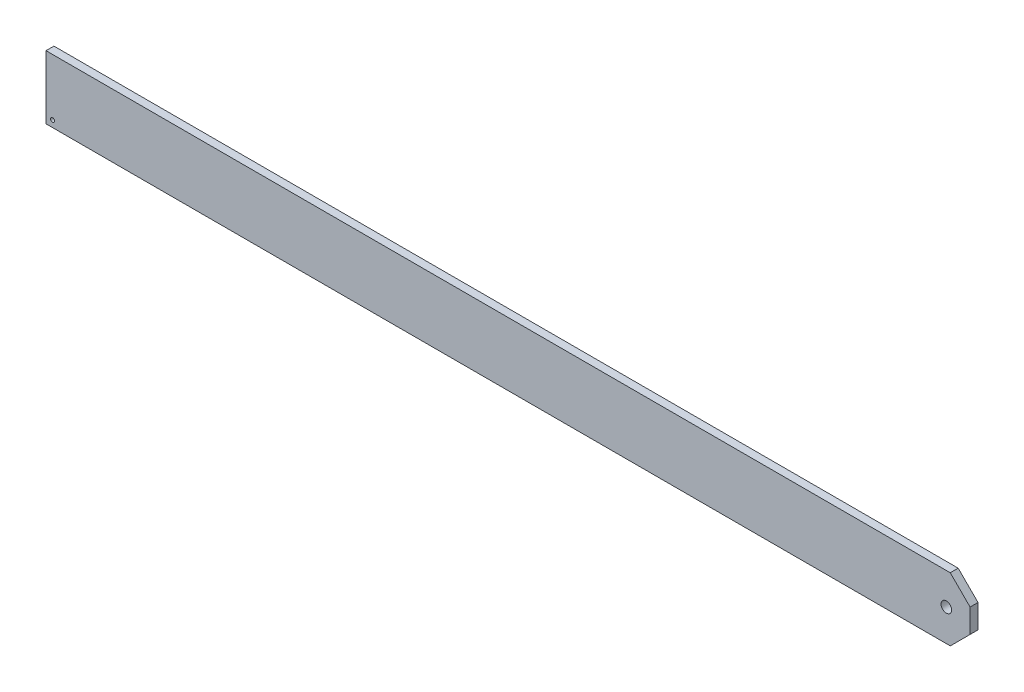
ISO-10303-21;
HEADER;
FILE_DESCRIPTION(('STEP AP214'),'2;1');
FILE_NAME('part.step','',(''),(''),'','','');
FILE_SCHEMA(('AUTOMOTIVE_DESIGN { 1 0 10303 214 1 1 1 1 }'));
ENDSEC;
DATA;
#1=APPLICATION_CONTEXT('core data for automotive mechanical design processes');
#2=APPLICATION_PROTOCOL_DEFINITION('international standard','automotive_design',2000,#1);
#3=PRODUCT_CONTEXT('',#1,'mechanical');
#4=PRODUCT('Part','Part','',(#3));
#5=PRODUCT_RELATED_PRODUCT_CATEGORY('part','',(#4));
#6=PRODUCT_DEFINITION_FORMATION('','',#4);
#7=PRODUCT_DEFINITION_CONTEXT('part definition',#1,'design');
#8=PRODUCT_DEFINITION('design','',#6,#7);
#9=PRODUCT_DEFINITION_SHAPE('','',#8);
#10=(LENGTH_UNIT() NAMED_UNIT(*) SI_UNIT(.MILLI.,.METRE.));
#11=(NAMED_UNIT(*) PLANE_ANGLE_UNIT() SI_UNIT($,.RADIAN.));
#12=(NAMED_UNIT(*) SI_UNIT($,.STERADIAN.) SOLID_ANGLE_UNIT());
#13=UNCERTAINTY_MEASURE_WITH_UNIT(LENGTH_MEASURE(1.E-05),#10,'distance_accuracy_value','');
#14=(GEOMETRIC_REPRESENTATION_CONTEXT(3) GLOBAL_UNCERTAINTY_ASSIGNED_CONTEXT((#13)) GLOBAL_UNIT_ASSIGNED_CONTEXT((#10,
#11,#12)) REPRESENTATION_CONTEXT('',''));
#15=CARTESIAN_POINT('',(0.,0.,0.));
#16=DIRECTION('',(0.,0.,1.));
#17=DIRECTION('',(1.,0.,0.));
#18=AXIS2_PLACEMENT_3D('',#15,#16,#17);
#19=CARTESIAN_POINT('',(0.,0.,6.));
#20=DIRECTION('',(0.,0.,1.));
#21=DIRECTION('',(1.,0.,0.));
#22=AXIS2_PLACEMENT_3D('',#19,#20,#21);
#23=PLANE('',#22);
#24=CARTESIAN_POINT('',(-302.415730337079,17.1348314606742,6.));
#25=DIRECTION('',(0.,0.,1.));
#26=DIRECTION('',(1.,0.,0.));
#27=AXIS2_PLACEMENT_3D('',#24,#25,#26);
#28=CIRCLE('',#27,1.50000000000002);
#29=CARTESIAN_POINT('',(-300.915730337079,17.1348314606742,6.));
#30=VERTEX_POINT('',#29);
#31=EDGE_CURVE('E194',#30,#30,#28,.T.);
#32=ORIENTED_EDGE('',*,*,#31,.F.);
#33=EDGE_LOOP('',(#32));
#34=FACE_BOUND('',#33,.T.);
#35=DIRECTION('',(0.,-1.,0.));
#36=VECTOR('',#35,1.);
#37=CARTESIAN_POINT('',(-307.415730337079,60.1348314606742,6.));
#38=LINE('',#37,#36);
#39=CARTESIAN_POINT('',(-307.415730337079,60.1348314606742,6.));
#40=VERTEX_POINT('',#39);
#41=CARTESIAN_POINT('',(-307.415730337079,12.1348314606742,6.));
#42=VERTEX_POINT('',#41);
#43=EDGE_CURVE('E147',#40,#42,#38,.T.);
#44=ORIENTED_EDGE('',*,*,#43,.T.);
#45=DIRECTION('',(1.,0.,0.));
#46=VECTOR('',#45,1.);
#47=CARTESIAN_POINT('',(-307.415730337079,12.1348314606742,6.));
#48=LINE('',#47,#46);
#49=CARTESIAN_POINT('',(377.584269662921,12.1348314606742,6.));
#50=VERTEX_POINT('',#49);
#51=EDGE_CURVE('E95',#42,#50,#48,.T.);
#52=ORIENTED_EDGE('',*,*,#51,.T.);
#53=DIRECTION('',(0.707106781186548,0.707106781186547,0.));
#54=VECTOR('',#53,1.);
#55=CARTESIAN_POINT('',(377.584269662921,12.1348314606742,6.));
#56=LINE('',#55,#54);
#57=CARTESIAN_POINT('',(392.584269662921,27.1348314606742,6.));
#58=VERTEX_POINT('',#57);
#59=EDGE_CURVE('E108',#50,#58,#56,.T.);
#60=ORIENTED_EDGE('',*,*,#59,.T.);
#61=DIRECTION('',(0.,1.,0.));
#62=VECTOR('',#61,1.);
#63=CARTESIAN_POINT('',(392.584269662921,45.1348314606742,6.));
#64=LINE('',#63,#62);
#65=CARTESIAN_POINT('',(392.584269662921,45.1348314606742,6.));
#66=VERTEX_POINT('',#65);
#67=EDGE_CURVE('E102',#58,#66,#64,.T.);
#68=ORIENTED_EDGE('',*,*,#67,.T.);
#69=DIRECTION('',(-0.707106781186548,0.707106781186547,0.));
#70=VECTOR('',#69,1.);
#71=CARTESIAN_POINT('',(377.584269662921,60.1348314606742,6.));
#72=LINE('',#71,#70);
#73=CARTESIAN_POINT('',(377.584269662921,60.1348314606742,6.));
#74=VERTEX_POINT('',#73);
#75=EDGE_CURVE('E106',#66,#74,#72,.T.);
#76=ORIENTED_EDGE('',*,*,#75,.T.);
#77=DIRECTION('',(-1.,0.,0.));
#78=VECTOR('',#77,1.);
#79=CARTESIAN_POINT('',(-307.415730337079,60.1348314606742,6.));
#80=LINE('',#79,#78);
#81=EDGE_CURVE('E58',#74,#40,#80,.T.);
#82=ORIENTED_EDGE('',*,*,#81,.T.);
#83=EDGE_LOOP('',(#44,#52,#60,#68,#76,#82));
#84=FACE_BOUND('',#83,.T.);
#85=CARTESIAN_POINT('',(374.584269662921,36.1348314606742,6.));
#86=DIRECTION('',(0.,0.,1.));
#87=DIRECTION('',(1.,0.,0.));
#88=AXIS2_PLACEMENT_3D('',#85,#86,#87);
#89=CIRCLE('',#88,3.99999999999999);
#90=CARTESIAN_POINT('',(378.584269662921,36.1348314606742,6.));
#91=VERTEX_POINT('',#90);
#92=EDGE_CURVE('E135',#91,#91,#89,.T.);
#93=ORIENTED_EDGE('',*,*,#92,.F.);
#94=EDGE_LOOP('',(#93));
#95=FACE_BOUND('',#94,.T.);
#96=ADVANCED_FACE('F39',(#34,#84,#95),#23,.T.);
#97=CARTESIAN_POINT('',(0.,0.,0.));
#98=DIRECTION('',(0.,0.,1.));
#99=DIRECTION('',(1.,0.,0.));
#100=AXIS2_PLACEMENT_3D('',#97,#98,#99);
#101=PLANE('',#100);
#102=CARTESIAN_POINT('',(-302.415730337079,17.1348314606742,0.));
#103=DIRECTION('',(0.,0.,1.));
#104=DIRECTION('',(1.,0.,0.));
#105=AXIS2_PLACEMENT_3D('',#102,#103,#104);
#106=CIRCLE('',#105,1.50000000000002);
#107=CARTESIAN_POINT('',(-300.915730337079,17.1348314606742,0.));
#108=VERTEX_POINT('',#107);
#109=EDGE_CURVE('E43',#108,#108,#106,.T.);
#110=ORIENTED_EDGE('',*,*,#109,.T.);
#111=EDGE_LOOP('',(#110));
#112=FACE_BOUND('',#111,.T.);
#113=DIRECTION('',(0.,-1.,0.));
#114=VECTOR('',#113,1.);
#115=CARTESIAN_POINT('',(-307.415730337079,60.1348314606742,0.));
#116=LINE('',#115,#114);
#117=CARTESIAN_POINT('',(-307.415730337079,60.1348314606742,0.));
#118=VERTEX_POINT('',#117);
#119=CARTESIAN_POINT('',(-307.415730337079,12.1348314606742,0.));
#120=VERTEX_POINT('',#119);
#121=EDGE_CURVE('E130',#118,#120,#116,.T.);
#122=ORIENTED_EDGE('',*,*,#121,.F.);
#123=DIRECTION('',(-1.,0.,0.));
#124=VECTOR('',#123,1.);
#125=CARTESIAN_POINT('',(-307.415730337079,60.1348314606742,0.));
#126=LINE('',#125,#124);
#127=CARTESIAN_POINT('',(377.584269662921,60.1348314606742,0.));
#128=VERTEX_POINT('',#127);
#129=EDGE_CURVE('E87',#128,#118,#126,.T.);
#130=ORIENTED_EDGE('',*,*,#129,.F.);
#131=DIRECTION('',(-0.707106781186548,0.707106781186547,0.));
#132=VECTOR('',#131,1.);
#133=CARTESIAN_POINT('',(377.584269662921,60.1348314606742,0.));
#134=LINE('',#133,#132);
#135=CARTESIAN_POINT('',(392.584269662921,45.1348314606742,0.));
#136=VERTEX_POINT('',#135);
#137=EDGE_CURVE('E81',#136,#128,#134,.T.);
#138=ORIENTED_EDGE('',*,*,#137,.F.);
#139=DIRECTION('',(0.,1.,0.));
#140=VECTOR('',#139,1.);
#141=CARTESIAN_POINT('',(392.584269662921,45.1348314606742,0.));
#142=LINE('',#141,#140);
#143=CARTESIAN_POINT('',(392.584269662921,27.1348314606742,0.));
#144=VERTEX_POINT('',#143);
#145=EDGE_CURVE('E117',#144,#136,#142,.T.);
#146=ORIENTED_EDGE('',*,*,#145,.F.);
#147=DIRECTION('',(0.707106781186548,0.707106781186547,0.));
#148=VECTOR('',#147,1.);
#149=CARTESIAN_POINT('',(377.584269662921,12.1348314606742,0.));
#150=LINE('',#149,#148);
#151=CARTESIAN_POINT('',(377.584269662921,12.1348314606742,0.));
#152=VERTEX_POINT('',#151);
#153=EDGE_CURVE('E138',#152,#144,#150,.T.);
#154=ORIENTED_EDGE('',*,*,#153,.F.);
#155=DIRECTION('',(1.,0.,0.));
#156=VECTOR('',#155,1.);
#157=CARTESIAN_POINT('',(-307.415730337079,12.1348314606742,0.));
#158=LINE('',#157,#156);
#159=EDGE_CURVE('E134',#120,#152,#158,.T.);
#160=ORIENTED_EDGE('',*,*,#159,.F.);
#161=EDGE_LOOP('',(#122,#130,#138,#146,#154,#160));
#162=FACE_BOUND('',#161,.T.);
#163=CARTESIAN_POINT('',(374.584269662921,36.1348314606742,0.));
#164=DIRECTION('',(0.,0.,1.));
#165=DIRECTION('',(1.,0.,0.));
#166=AXIS2_PLACEMENT_3D('',#163,#164,#165);
#167=CIRCLE('',#166,3.99999999999999);
#168=CARTESIAN_POINT('',(378.584269662921,36.1348314606742,0.));
#169=VERTEX_POINT('',#168);
#170=EDGE_CURVE('E198',#169,#169,#167,.T.);
#171=ORIENTED_EDGE('',*,*,#170,.T.);
#172=EDGE_LOOP('',(#171));
#173=FACE_BOUND('',#172,.T.);
#174=ADVANCED_FACE('F161',(#112,#162,#173),#101,.F.);
#175=CARTESIAN_POINT('',(-307.415730337079,60.1348314606742,6.));
#176=DIRECTION('',(1.,0.,0.));
#177=DIRECTION('',(0.,0.,-1.));
#178=AXIS2_PLACEMENT_3D('',#175,#176,#177);
#179=PLANE('',#178);
#180=ORIENTED_EDGE('',*,*,#121,.T.);
#181=DIRECTION('',(0.,0.,-1.));
#182=VECTOR('',#181,1.);
#183=CARTESIAN_POINT('',(-307.415730337079,12.1348314606742,6.));
#184=LINE('',#183,#182);
#185=EDGE_CURVE('E11',#42,#120,#184,.T.);
#186=ORIENTED_EDGE('',*,*,#185,.F.);
#187=ORIENTED_EDGE('',*,*,#43,.F.);
#188=DIRECTION('',(0.,0.,-1.));
#189=VECTOR('',#188,1.);
#190=CARTESIAN_POINT('',(-307.415730337079,60.1348314606742,6.));
#191=LINE('',#190,#189);
#192=EDGE_CURVE('E126',#40,#118,#191,.T.);
#193=ORIENTED_EDGE('',*,*,#192,.T.);
#194=EDGE_LOOP('',(#180,#186,#187,#193));
#195=FACE_BOUND('',#194,.T.);
#196=ADVANCED_FACE('F41',(#195),#179,.F.);
#197=CARTESIAN_POINT('',(-307.415730337079,12.1348314606742,6.));
#198=DIRECTION('',(0.,1.,0.));
#199=DIRECTION('',(0.,0.,1.));
#200=AXIS2_PLACEMENT_3D('',#197,#198,#199);
#201=PLANE('',#200);
#202=ORIENTED_EDGE('',*,*,#159,.T.);
#203=DIRECTION('',(0.,0.,-1.));
#204=VECTOR('',#203,1.);
#205=CARTESIAN_POINT('',(377.584269662921,12.1348314606742,6.));
#206=LINE('',#205,#204);
#207=EDGE_CURVE('E50',#50,#152,#206,.T.);
#208=ORIENTED_EDGE('',*,*,#207,.F.);
#209=ORIENTED_EDGE('',*,*,#51,.F.);
#210=ORIENTED_EDGE('',*,*,#185,.T.);
#211=EDGE_LOOP('',(#202,#208,#209,#210));
#212=FACE_BOUND('',#211,.T.);
#213=ADVANCED_FACE('F241',(#212),#201,.F.);
#214=CARTESIAN_POINT('',(377.584269662921,12.1348314606742,6.));
#215=DIRECTION('',(-0.707106781186547,0.707106781186548,0.));
#216=DIRECTION('',(-0.707106781186548,-0.707106781186547,0.));
#217=AXIS2_PLACEMENT_3D('',#214,#215,#216);
#218=PLANE('',#217);
#219=ORIENTED_EDGE('',*,*,#153,.T.);
#220=DIRECTION('',(0.,0.,-1.));
#221=VECTOR('',#220,1.);
#222=CARTESIAN_POINT('',(392.584269662921,27.1348314606742,6.));
#223=LINE('',#222,#221);
#224=EDGE_CURVE('E119',#58,#144,#223,.T.);
#225=ORIENTED_EDGE('',*,*,#224,.F.);
#226=ORIENTED_EDGE('',*,*,#59,.F.);
#227=ORIENTED_EDGE('',*,*,#207,.T.);
#228=EDGE_LOOP('',(#219,#225,#226,#227));
#229=FACE_BOUND('',#228,.T.);
#230=ADVANCED_FACE('F158',(#229),#218,.F.);
#231=CARTESIAN_POINT('',(392.584269662921,45.1348314606742,6.));
#232=DIRECTION('',(-1.,0.,0.));
#233=DIRECTION('',(0.,0.,1.));
#234=AXIS2_PLACEMENT_3D('',#231,#232,#233);
#235=PLANE('',#234);
#236=ORIENTED_EDGE('',*,*,#145,.T.);
#237=DIRECTION('',(0.,0.,-1.));
#238=VECTOR('',#237,1.);
#239=CARTESIAN_POINT('',(392.584269662921,45.1348314606742,6.));
#240=LINE('',#239,#238);
#241=EDGE_CURVE('E114',#66,#136,#240,.T.);
#242=ORIENTED_EDGE('',*,*,#241,.F.);
#243=ORIENTED_EDGE('',*,*,#67,.F.);
#244=ORIENTED_EDGE('',*,*,#224,.T.);
#245=EDGE_LOOP('',(#236,#242,#243,#244));
#246=FACE_BOUND('',#245,.T.);
#247=ADVANCED_FACE('F115',(#246),#235,.F.);
#248=CARTESIAN_POINT('',(377.584269662921,60.1348314606742,6.));
#249=DIRECTION('',(-0.707106781186547,-0.707106781186548,0.));
#250=DIRECTION('',(0.707106781186548,-0.707106781186547,0.));
#251=AXIS2_PLACEMENT_3D('',#248,#249,#250);
#252=PLANE('',#251);
#253=ORIENTED_EDGE('',*,*,#137,.T.);
#254=DIRECTION('',(0.,0.,-1.));
#255=VECTOR('',#254,1.);
#256=CARTESIAN_POINT('',(377.584269662921,60.1348314606742,6.));
#257=LINE('',#256,#255);
#258=EDGE_CURVE('E120',#74,#128,#257,.T.);
#259=ORIENTED_EDGE('',*,*,#258,.F.);
#260=ORIENTED_EDGE('',*,*,#75,.F.);
#261=ORIENTED_EDGE('',*,*,#241,.T.);
#262=EDGE_LOOP('',(#253,#259,#260,#261));
#263=FACE_BOUND('',#262,.T.);
#264=ADVANCED_FACE('F122',(#263),#252,.F.);
#265=CARTESIAN_POINT('',(-307.415730337079,60.1348314606742,6.));
#266=DIRECTION('',(0.,-1.,0.));
#267=DIRECTION('',(0.,0.,-1.));
#268=AXIS2_PLACEMENT_3D('',#265,#266,#267);
#269=PLANE('',#268);
#270=ORIENTED_EDGE('',*,*,#129,.T.);
#271=ORIENTED_EDGE('',*,*,#192,.F.);
#272=ORIENTED_EDGE('',*,*,#81,.F.);
#273=ORIENTED_EDGE('',*,*,#258,.T.);
#274=EDGE_LOOP('',(#270,#271,#272,#273));
#275=FACE_BOUND('',#274,.T.);
#276=ADVANCED_FACE('F166',(#275),#269,.F.);
#277=CARTESIAN_POINT('',(374.584269662921,36.1348314606742,6.));
#278=DIRECTION('',(0.,0.,-1.));
#279=DIRECTION('',(-1.,0.,0.));
#280=AXIS2_PLACEMENT_3D('',#277,#278,#279);
#281=CYLINDRICAL_SURFACE('',#280,3.99999999999999);
#282=ORIENTED_EDGE('',*,*,#92,.T.);
#283=EDGE_LOOP('',(#282));
#284=FACE_BOUND('',#283,.T.);
#285=ORIENTED_EDGE('',*,*,#170,.F.);
#286=EDGE_LOOP('',(#285));
#287=FACE_BOUND('',#286,.T.);
#288=ADVANCED_FACE('F168',(#284,#287),#281,.F.);
#289=CARTESIAN_POINT('',(-302.415730337079,17.1348314606742,-4.));
#290=DIRECTION('',(0.,0.,1.));
#291=DIRECTION('',(1.,0.,0.));
#292=AXIS2_PLACEMENT_3D('',#289,#290,#291);
#293=CYLINDRICAL_SURFACE('',#292,1.50000000000002);
#294=ORIENTED_EDGE('',*,*,#31,.T.);
#295=EDGE_LOOP('',(#294));
#296=FACE_BOUND('',#295,.T.);
#297=ORIENTED_EDGE('',*,*,#109,.F.);
#298=EDGE_LOOP('',(#297));
#299=FACE_BOUND('',#298,.T.);
#300=ADVANCED_FACE('F174',(#296,#299),#293,.F.);
#301=CLOSED_SHELL('',(#96,#174,#196,#213,#230,#247,#264,#276,#288,#300));
#302=MANIFOLD_SOLID_BREP('B2',#301);
#303=ADVANCED_BREP_SHAPE_REPRESENTATION('',(#18,#302),#14);
#304=SHAPE_DEFINITION_REPRESENTATION(#9,#303);
ENDSEC;
END-ISO-10303-21;
